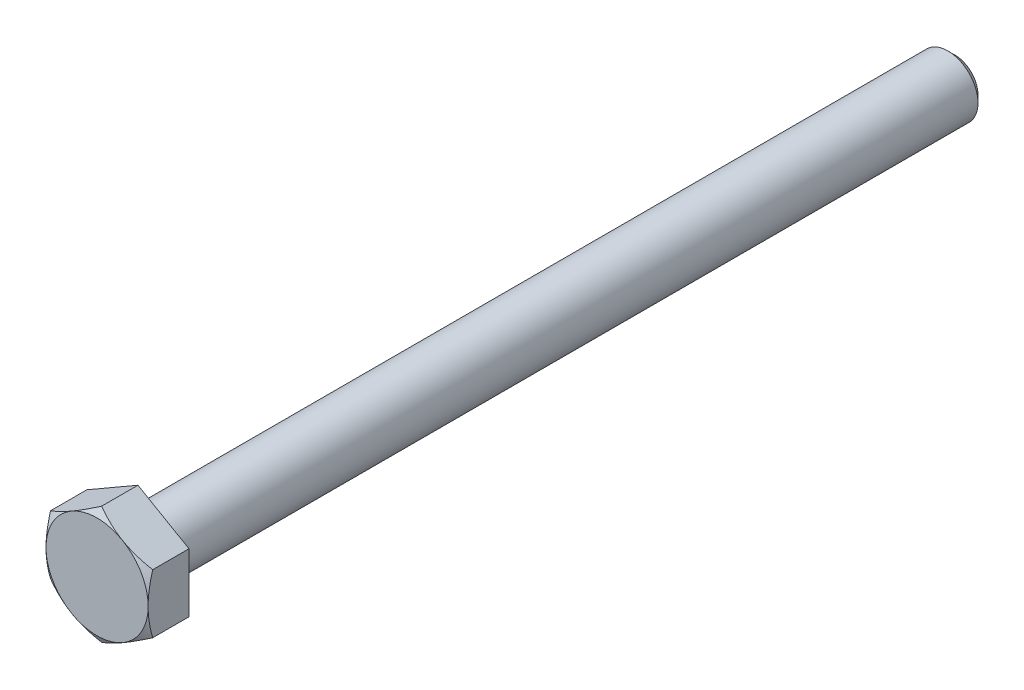
ISO-10303-21;
HEADER;
FILE_DESCRIPTION(('STEP AP214'),'2;1');
FILE_NAME('part.step','',(''),(''),'','','');
FILE_SCHEMA(('AUTOMOTIVE_DESIGN { 1 0 10303 214 1 1 1 1 }'));
ENDSEC;
DATA;
#1=APPLICATION_CONTEXT('core data for automotive mechanical design processes');
#2=APPLICATION_PROTOCOL_DEFINITION('international standard','automotive_design',2000,#1);
#3=PRODUCT_CONTEXT('',#1,'mechanical');
#4=PRODUCT('Part','Part','',(#3));
#5=PRODUCT_RELATED_PRODUCT_CATEGORY('part','',(#4));
#6=PRODUCT_DEFINITION_FORMATION('','',#4);
#7=PRODUCT_DEFINITION_CONTEXT('part definition',#1,'design');
#8=PRODUCT_DEFINITION('design','',#6,#7);
#9=PRODUCT_DEFINITION_SHAPE('','',#8);
#10=(LENGTH_UNIT() NAMED_UNIT(*) SI_UNIT(.MILLI.,.METRE.));
#11=(NAMED_UNIT(*) PLANE_ANGLE_UNIT() SI_UNIT($,.RADIAN.));
#12=(NAMED_UNIT(*) SI_UNIT($,.STERADIAN.) SOLID_ANGLE_UNIT());
#13=UNCERTAINTY_MEASURE_WITH_UNIT(LENGTH_MEASURE(1.E-05),#10,'distance_accuracy_value','');
#14=(GEOMETRIC_REPRESENTATION_CONTEXT(3) GLOBAL_UNCERTAINTY_ASSIGNED_CONTEXT((#13)) GLOBAL_UNIT_ASSIGNED_CONTEXT((#10,
#11,#12)) REPRESENTATION_CONTEXT('',''));
#15=CARTESIAN_POINT('',(0.,0.,0.));
#16=DIRECTION('',(0.,0.,1.));
#17=DIRECTION('',(1.,0.,0.));
#18=AXIS2_PLACEMENT_3D('',#15,#16,#17);
#19=CARTESIAN_POINT('',(-5.,-2.88675134594813,4.));
#20=DIRECTION('',(0.,0.,1.));
#21=DIRECTION('',(1.,0.,0.));
#22=AXIS2_PLACEMENT_3D('',#19,#20,#21);
#23=PLANE('',#22);
#24=CARTESIAN_POINT('',(0.,0.,4.));
#25=DIRECTION('',(0.,0.,1.));
#26=DIRECTION('',(1.,0.,0.));
#27=AXIS2_PLACEMENT_3D('',#24,#25,#26);
#28=CIRCLE('',#27,5.);
#29=CARTESIAN_POINT('',(2.5,-4.33012701892219,4.));
#30=VERTEX_POINT('',#29);
#31=CARTESIAN_POINT('',(5.,0.,4.));
#32=VERTEX_POINT('',#31);
#33=EDGE_CURVE('E170',#30,#32,#28,.T.);
#34=ORIENTED_EDGE('',*,*,#33,.T.);
#35=CARTESIAN_POINT('',(0.,0.,4.));
#36=DIRECTION('',(0.,0.,1.));
#37=DIRECTION('',(1.,0.,0.));
#38=AXIS2_PLACEMENT_3D('',#35,#36,#37);
#39=CIRCLE('',#38,5.);
#40=CARTESIAN_POINT('',(2.5,4.33012701892219,4.));
#41=VERTEX_POINT('',#40);
#42=EDGE_CURVE('E11',#32,#41,#39,.T.);
#43=ORIENTED_EDGE('',*,*,#42,.T.);
#44=CARTESIAN_POINT('',(0.,0.,4.));
#45=DIRECTION('',(0.,0.,1.));
#46=DIRECTION('',(1.,0.,0.));
#47=AXIS2_PLACEMENT_3D('',#44,#45,#46);
#48=CIRCLE('',#47,5.);
#49=CARTESIAN_POINT('',(-2.5,4.3301270189222,4.));
#50=VERTEX_POINT('',#49);
#51=EDGE_CURVE('E28',#41,#50,#48,.T.);
#52=ORIENTED_EDGE('',*,*,#51,.T.);
#53=CARTESIAN_POINT('',(0.,0.,4.));
#54=DIRECTION('',(0.,0.,1.));
#55=DIRECTION('',(1.,0.,0.));
#56=AXIS2_PLACEMENT_3D('',#53,#54,#55);
#57=CIRCLE('',#56,5.);
#58=CARTESIAN_POINT('',(-5.,0.,4.));
#59=VERTEX_POINT('',#58);
#60=EDGE_CURVE('E182',#50,#59,#57,.T.);
#61=ORIENTED_EDGE('',*,*,#60,.T.);
#62=CARTESIAN_POINT('',(0.,0.,4.));
#63=DIRECTION('',(0.,0.,1.));
#64=DIRECTION('',(1.,0.,0.));
#65=AXIS2_PLACEMENT_3D('',#62,#63,#64);
#66=CIRCLE('',#65,5.);
#67=CARTESIAN_POINT('',(-2.5,-4.33012701892219,4.));
#68=VERTEX_POINT('',#67);
#69=EDGE_CURVE('E179',#59,#68,#66,.T.);
#70=ORIENTED_EDGE('',*,*,#69,.T.);
#71=CARTESIAN_POINT('',(0.,0.,4.));
#72=DIRECTION('',(0.,0.,1.));
#73=DIRECTION('',(1.,0.,0.));
#74=AXIS2_PLACEMENT_3D('',#71,#72,#73);
#75=CIRCLE('',#74,5.);
#76=EDGE_CURVE('E174',#68,#30,#75,.T.);
#77=ORIENTED_EDGE('',*,*,#76,.T.);
#78=EDGE_LOOP('',(#34,#43,#52,#61,#70,#77));
#79=FACE_BOUND('',#78,.T.);
#80=ADVANCED_FACE('F17',(#79),#23,.T.);
#81=CARTESIAN_POINT('',(0.,0.,4.));
#82=DIRECTION('',(0.,0.,-1.));
#83=DIRECTION('',(1.,0.,0.));
#84=AXIS2_PLACEMENT_3D('',#81,#82,#83);
#85=CONICAL_SURFACE('',#84,5.,1.0471975511966);
#86=CARTESIAN_POINT('',(5.00000000000001,0.,3.99999999999999));
#87=CARTESIAN_POINT('',(5.00000000000001,1.3397459621589,3.99999999999999));
#88=CARTESIAN_POINT('',(5.00000000000001,2.88675134595628,3.55341801261243));
#89=(BOUNDED_CURVE() B_SPLINE_CURVE(2,(#86,#87,#88),.UNSPECIFIED.,.F.,
.F.) B_SPLINE_CURVE_WITH_KNOTS((3,3),(1.36602540378444,1.90331036969753),
.UNSPECIFIED.) CURVE() GEOMETRIC_REPRESENTATION_ITEM() RATIONAL_B_SPLINE_CURVE((1.86602540378444,
1.86602540378444,1.73205080756823)) REPRESENTATION_ITEM(''));
#90=CARTESIAN_POINT('',(5.,2.88675134594813,3.55341801261479));
#91=VERTEX_POINT('',#90);
#92=EDGE_CURVE('E230',#32,#91,#89,.T.);
#93=ORIENTED_EDGE('',*,*,#92,.T.);
#94=CARTESIAN_POINT('',(5.00000000000706,2.88675134594406,3.55341801261243));
#95=CARTESIAN_POINT('',(3.66025403784724,3.66025403784274,3.99999999999998));
#96=CARTESIAN_POINT('',(2.50000000000003,4.33012701892218,3.99999999999999));
#97=(BOUNDED_CURVE() B_SPLINE_CURVE(2,(#94,#95,#96),.UNSPECIFIED.,.F.,
.F.) B_SPLINE_CURVE_WITH_KNOTS((3,3),(0.828740437871357,1.36602540378444),
.UNSPECIFIED.) CURVE() GEOMETRIC_REPRESENTATION_ITEM() RATIONAL_B_SPLINE_CURVE((1.73205080756823,
1.86602540378444,1.86602540378444)) REPRESENTATION_ITEM(''));
#98=EDGE_CURVE('E219',#91,#41,#97,.T.);
#99=ORIENTED_EDGE('',*,*,#98,.T.);
#100=ORIENTED_EDGE('',*,*,#42,.F.);
#101=EDGE_LOOP('',(#93,#99,#100));
#102=FACE_BOUND('',#101,.T.);
#103=ADVANCED_FACE('F305',(#102),#85,.T.);
#104=CARTESIAN_POINT('',(0.,0.,4.));
#105=DIRECTION('',(0.,0.,-1.));
#106=DIRECTION('',(1.,0.,0.));
#107=AXIS2_PLACEMENT_3D('',#104,#105,#106);
#108=CONICAL_SURFACE('',#107,5.,1.0471975511966);
#109=CARTESIAN_POINT('',(2.50000000000003,4.33012701892218,3.99999999999999));
#110=CARTESIAN_POINT('',(1.3397459621528,5.00000000000162,4.));
#111=CARTESIAN_POINT('',(-7.03419750679371E-12,5.77350269190032,3.55341801261244));
#112=(BOUNDED_CURVE() B_SPLINE_CURVE(2,(#109,#110,#111),.UNSPECIFIED.,.F.,
.F.) B_SPLINE_CURVE_WITH_KNOTS((3,3),(1.36602540378444,1.90331036969752),
.UNSPECIFIED.) CURVE() GEOMETRIC_REPRESENTATION_ITEM() RATIONAL_B_SPLINE_CURVE((1.86602540378444,
1.86602540378445,1.73205080756823)) REPRESENTATION_ITEM(''));
#113=CARTESIAN_POINT('',(0.,5.77350269189626,3.55341801261479));
#114=VERTEX_POINT('',#113);
#115=EDGE_CURVE('E218',#41,#114,#112,.T.);
#116=ORIENTED_EDGE('',*,*,#115,.T.);
#117=CARTESIAN_POINT('',(7.05265794858301E-12,5.77350269190033,3.55341801261244));
#118=CARTESIAN_POINT('',(-1.33974596215277,5.00000000000165,3.99999999999999));
#119=CARTESIAN_POINT('',(-2.49999999999998,4.33012701892221,3.99999999999999));
#120=(BOUNDED_CURVE() B_SPLINE_CURVE(2,(#117,#118,#119),.UNSPECIFIED.,.F.,
.F.) B_SPLINE_CURVE_WITH_KNOTS((3,3),(0.828740437871358,1.36602540378444),
.UNSPECIFIED.) CURVE() GEOMETRIC_REPRESENTATION_ITEM() RATIONAL_B_SPLINE_CURVE((1.73205080756823,
1.86602540378444,1.86602540378444)) REPRESENTATION_ITEM(''));
#121=EDGE_CURVE('E240',#114,#50,#120,.T.);
#122=ORIENTED_EDGE('',*,*,#121,.T.);
#123=ORIENTED_EDGE('',*,*,#51,.F.);
#124=EDGE_LOOP('',(#116,#122,#123));
#125=FACE_BOUND('',#124,.T.);
#126=ADVANCED_FACE('F313',(#125),#108,.T.);
#127=CARTESIAN_POINT('',(0.,0.,4.));
#128=DIRECTION('',(0.,0.,-1.));
#129=DIRECTION('',(1.,0.,0.));
#130=AXIS2_PLACEMENT_3D('',#127,#128,#129);
#131=CONICAL_SURFACE('',#130,5.,1.0471975511966);
#132=CARTESIAN_POINT('',(-5.,2.88675134595627,3.55341801261243));
#133=CARTESIAN_POINT('',(-5.,1.33974596215889,3.99999999999999));
#134=CARTESIAN_POINT('',(-5.,0.,3.99999999999999));
#135=(BOUNDED_CURVE() B_SPLINE_CURVE(2,(#132,#133,#134),.UNSPECIFIED.,.F.,
.F.) B_SPLINE_CURVE_WITH_KNOTS((3,3),(0.828740437871356,1.36602540378444),
.UNSPECIFIED.) CURVE() GEOMETRIC_REPRESENTATION_ITEM() RATIONAL_B_SPLINE_CURVE((1.73205080756823,
1.86602540378445,1.86602540378445)) REPRESENTATION_ITEM(''));
#136=CARTESIAN_POINT('',(-5.,2.88675134594813,3.55341801261479));
#137=VERTEX_POINT('',#136);
#138=EDGE_CURVE('E131',#137,#59,#135,.T.);
#139=ORIENTED_EDGE('',*,*,#138,.T.);
#140=ORIENTED_EDGE('',*,*,#60,.F.);
#141=CARTESIAN_POINT('',(-2.49999999999998,4.33012701892221,3.99999999999999));
#142=CARTESIAN_POINT('',(-3.66025403784722,3.66025403784276,4.));
#143=CARTESIAN_POINT('',(-5.00000000000707,2.88675134594405,3.55341801261243));
#144=(BOUNDED_CURVE() B_SPLINE_CURVE(2,(#141,#142,#143),.UNSPECIFIED.,.F.,
.F.) B_SPLINE_CURVE_WITH_KNOTS((3,3),(1.36602540378444,1.90331036969753),
.UNSPECIFIED.) CURVE() GEOMETRIC_REPRESENTATION_ITEM() RATIONAL_B_SPLINE_CURVE((1.86602540378444,
1.86602540378444,1.73205080756823)) REPRESENTATION_ITEM(''));
#145=EDGE_CURVE('E175',#50,#137,#144,.T.);
#146=ORIENTED_EDGE('',*,*,#145,.T.);
#147=EDGE_LOOP('',(#139,#140,#146));
#148=FACE_BOUND('',#147,.T.);
#149=ADVANCED_FACE('F577',(#148),#131,.T.);
#150=CARTESIAN_POINT('',(0.,0.,4.));
#151=DIRECTION('',(0.,0.,-1.));
#152=DIRECTION('',(1.,0.,0.));
#153=AXIS2_PLACEMENT_3D('',#150,#151,#152);
#154=CONICAL_SURFACE('',#153,5.,1.0471975511966);
#155=CARTESIAN_POINT('',(-5.,0.,3.99999999999999));
#156=CARTESIAN_POINT('',(-5.,-1.33974596215888,3.99999999999999));
#157=CARTESIAN_POINT('',(-5.,-2.88675134595629,3.55341801261243));
#158=(BOUNDED_CURVE() B_SPLINE_CURVE(2,(#155,#156,#157),.UNSPECIFIED.,.F.,
.F.) B_SPLINE_CURVE_WITH_KNOTS((3,3),(1.36602540378444,1.90331036969753),
.UNSPECIFIED.) CURVE() GEOMETRIC_REPRESENTATION_ITEM() RATIONAL_B_SPLINE_CURVE((1.86602540378445,
1.86602540378445,1.73205080756823)) REPRESENTATION_ITEM(''));
#159=CARTESIAN_POINT('',(-5.,-2.88675134594813,3.55341801261479));
#160=VERTEX_POINT('',#159);
#161=EDGE_CURVE('E178',#59,#160,#158,.T.);
#162=ORIENTED_EDGE('',*,*,#161,.T.);
#163=CARTESIAN_POINT('',(-5.00000000000705,-2.88675134594406,3.55341801261244));
#164=CARTESIAN_POINT('',(-3.66025403784723,-3.66025403784275,3.99999999999999));
#165=CARTESIAN_POINT('',(-2.50000000000001,-4.33012701892219,3.99999999999999));
#166=(BOUNDED_CURVE() B_SPLINE_CURVE(2,(#163,#164,#165),.UNSPECIFIED.,.F.,
.F.) B_SPLINE_CURVE_WITH_KNOTS((3,3),(0.828740437871359,1.36602540378444),
.UNSPECIFIED.) CURVE() GEOMETRIC_REPRESENTATION_ITEM() RATIONAL_B_SPLINE_CURVE((1.73205080756823,
1.86602540378444,1.86602540378444)) REPRESENTATION_ITEM(''));
#167=EDGE_CURVE('E190',#160,#68,#166,.T.);
#168=ORIENTED_EDGE('',*,*,#167,.T.);
#169=ORIENTED_EDGE('',*,*,#69,.F.);
#170=EDGE_LOOP('',(#162,#168,#169));
#171=FACE_BOUND('',#170,.T.);
#172=ADVANCED_FACE('F567',(#171),#154,.T.);
#173=CARTESIAN_POINT('',(0.,0.,4.));
#174=DIRECTION('',(0.,0.,-1.));
#175=DIRECTION('',(1.,0.,0.));
#176=AXIS2_PLACEMENT_3D('',#173,#174,#175);
#177=CONICAL_SURFACE('',#176,5.,1.0471975511966);
#178=CARTESIAN_POINT('',(-2.50000000000001,-4.33012701892219,3.99999999999999));
#179=CARTESIAN_POINT('',(-1.33974596215279,-5.00000000000163,3.99999999999999));
#180=CARTESIAN_POINT('',(7.02804402619727E-12,-5.77350269190032,3.55341801261244));
#181=(BOUNDED_CURVE() B_SPLINE_CURVE(2,(#178,#179,#180),.UNSPECIFIED.,.F.,
.F.) B_SPLINE_CURVE_WITH_KNOTS((3,3),(1.36602540378444,1.90331036969752),
.UNSPECIFIED.) CURVE() GEOMETRIC_REPRESENTATION_ITEM() RATIONAL_B_SPLINE_CURVE((1.86602540378444,
1.86602540378444,1.73205080756823)) REPRESENTATION_ITEM(''));
#182=CARTESIAN_POINT('',(0.,-5.77350269189626,3.55341801261479));
#183=VERTEX_POINT('',#182);
#184=EDGE_CURVE('E212',#68,#183,#181,.T.);
#185=ORIENTED_EDGE('',*,*,#184,.T.);
#186=CARTESIAN_POINT('',(-7.04753004808599E-12,-5.77350269190033,3.55341801261244));
#187=CARTESIAN_POINT('',(1.33974596215279,-5.00000000000164,3.99999999999999));
#188=CARTESIAN_POINT('',(2.50000000000001,-4.33012701892219,3.99999999999999));
#189=(BOUNDED_CURVE() B_SPLINE_CURVE(2,(#186,#187,#188),.UNSPECIFIED.,.F.,
.F.) B_SPLINE_CURVE_WITH_KNOTS((3,3),(0.828740437871358,1.36602540378444),
.UNSPECIFIED.) CURVE() GEOMETRIC_REPRESENTATION_ITEM() RATIONAL_B_SPLINE_CURVE((1.73205080756823,
1.86602540378444,1.86602540378444)) REPRESENTATION_ITEM(''));
#190=EDGE_CURVE('E169',#183,#30,#189,.T.);
#191=ORIENTED_EDGE('',*,*,#190,.T.);
#192=ORIENTED_EDGE('',*,*,#76,.F.);
#193=EDGE_LOOP('',(#185,#191,#192));
#194=FACE_BOUND('',#193,.T.);
#195=ADVANCED_FACE('F557',(#194),#177,.T.);
#196=CARTESIAN_POINT('',(0.,0.,4.));
#197=DIRECTION('',(0.,0.,-1.));
#198=DIRECTION('',(1.,0.,0.));
#199=AXIS2_PLACEMENT_3D('',#196,#197,#198);
#200=CONICAL_SURFACE('',#199,5.,1.0471975511966);
#201=CARTESIAN_POINT('',(2.50000000000001,-4.33012701892219,3.99999999999999));
#202=CARTESIAN_POINT('',(3.66025403784718,-3.66025403784278,3.99999999999999));
#203=CARTESIAN_POINT('',(5.00000000000693,-2.88675134594413,3.55341801261248));
#204=(BOUNDED_CURVE() B_SPLINE_CURVE(2,(#201,#202,#203),.UNSPECIFIED.,.F.,
.F.) B_SPLINE_CURVE_WITH_KNOTS((3,3),(1.36602540378444,1.9033103696975),
.UNSPECIFIED.) CURVE() GEOMETRIC_REPRESENTATION_ITEM() RATIONAL_B_SPLINE_CURVE((1.86602540378444,
1.86602540378444,1.73205080756824)) REPRESENTATION_ITEM(''));
#205=CARTESIAN_POINT('',(5.,-2.88675134594836,3.55341801261495));
#206=VERTEX_POINT('',#205);
#207=EDGE_CURVE('E168',#30,#206,#204,.T.);
#208=ORIENTED_EDGE('',*,*,#207,.T.);
#209=CARTESIAN_POINT('',(5.00000000000001,-2.88675134595645,3.55341801261239));
#210=CARTESIAN_POINT('',(5.00000000000001,-1.33974596215895,3.99999999999999));
#211=CARTESIAN_POINT('',(5.00000000000001,0.,3.99999999999999));
#212=(BOUNDED_CURVE() B_SPLINE_CURVE(2,(#209,#210,#211),.UNSPECIFIED.,.F.,
.F.) B_SPLINE_CURVE_WITH_KNOTS((3,3),(0.828740437871329,1.36602540378444),
.UNSPECIFIED.) CURVE() GEOMETRIC_REPRESENTATION_ITEM() RATIONAL_B_SPLINE_CURVE((1.73205080756821,
1.86602540378444,1.86602540378444)) REPRESENTATION_ITEM(''));
#213=EDGE_CURVE('E231',#206,#32,#212,.T.);
#214=ORIENTED_EDGE('',*,*,#213,.T.);
#215=ORIENTED_EDGE('',*,*,#33,.F.);
#216=EDGE_LOOP('',(#208,#214,#215));
#217=FACE_BOUND('',#216,.T.);
#218=ADVANCED_FACE('F546',(#217),#200,.T.);
#219=CARTESIAN_POINT('',(0.,0.,-80.));
#220=DIRECTION('',(0.,0.,-1.));
#221=DIRECTION('',(-1.,0.,0.));
#222=AXIS2_PLACEMENT_3D('',#219,#220,#221);
#223=PLANE('',#222);
#224=CARTESIAN_POINT('',(0.,0.,-80.));
#225=DIRECTION('',(0.,0.,-1.));
#226=DIRECTION('',(1.,0.,0.));
#227=AXIS2_PLACEMENT_3D('',#224,#225,#226);
#228=CIRCLE('',#227,2.25);
#229=CARTESIAN_POINT('',(-2.25,0.,-80.));
#230=VERTEX_POINT('',#229);
#231=EDGE_CURVE('E183',#230,#230,#228,.T.);
#232=ORIENTED_EDGE('',*,*,#231,.T.);
#233=EDGE_LOOP('',(#232));
#234=FACE_BOUND('',#233,.T.);
#235=ADVANCED_FACE('F537',(#234),#223,.T.);
#236=CARTESIAN_POINT('',(0.,5.77350269189626,4.));
#237=DIRECTION('',(0.5,-0.866025403784439,0.));
#238=DIRECTION('',(0.,0.,-1.));
#239=AXIS2_PLACEMENT_3D('',#236,#237,#238);
#240=PLANE('',#239);
#241=ORIENTED_EDGE('',*,*,#121,.F.);
#242=DIRECTION('',(0.,0.,-1.));
#243=VECTOR('',#242,1.);
#244=CARTESIAN_POINT('',(0.,5.77350269189626,4.));
#245=LINE('',#244,#243);
#246=CARTESIAN_POINT('',(0.,5.77350269189626,0.));
#247=VERTEX_POINT('',#246);
#248=EDGE_CURVE('E141',#114,#247,#245,.T.);
#249=ORIENTED_EDGE('',*,*,#248,.T.);
#250=DIRECTION('',(-0.866025403784439,-0.5,0.));
#251=VECTOR('',#250,1.);
#252=CARTESIAN_POINT('',(0.,5.77350269189626,0.));
#253=LINE('',#252,#251);
#254=CARTESIAN_POINT('',(-5.,2.88675134594813,0.));
#255=VERTEX_POINT('',#254);
#256=EDGE_CURVE('E138',#247,#255,#253,.T.);
#257=ORIENTED_EDGE('',*,*,#256,.T.);
#258=DIRECTION('',(0.,0.,-1.));
#259=VECTOR('',#258,1.);
#260=CARTESIAN_POINT('',(-5.,2.88675134594813,4.));
#261=LINE('',#260,#259);
#262=EDGE_CURVE('E123',#137,#255,#261,.T.);
#263=ORIENTED_EDGE('',*,*,#262,.F.);
#264=ORIENTED_EDGE('',*,*,#145,.F.);
#265=EDGE_LOOP('',(#241,#249,#257,#263,#264));
#266=FACE_BOUND('',#265,.T.);
#267=ADVANCED_FACE('F139',(#266),#240,.F.);
#268=CARTESIAN_POINT('',(5.,2.88675134594813,4.));
#269=DIRECTION('',(-0.5,-0.866025403784439,0.));
#270=DIRECTION('',(-0.866025403784439,0.5,0.));
#271=AXIS2_PLACEMENT_3D('',#268,#269,#270);
#272=PLANE('',#271);
#273=ORIENTED_EDGE('',*,*,#98,.F.);
#274=DIRECTION('',(0.,0.,-1.));
#275=VECTOR('',#274,1.);
#276=CARTESIAN_POINT('',(5.,2.88675134594813,4.));
#277=LINE('',#276,#275);
#278=CARTESIAN_POINT('',(5.,2.88675134594813,0.));
#279=VERTEX_POINT('',#278);
#280=EDGE_CURVE('E227',#91,#279,#277,.T.);
#281=ORIENTED_EDGE('',*,*,#280,.T.);
#282=DIRECTION('',(-0.866025403784439,0.5,0.));
#283=VECTOR('',#282,1.);
#284=CARTESIAN_POINT('',(5.,2.88675134594813,0.));
#285=LINE('',#284,#283);
#286=EDGE_CURVE('E146',#279,#247,#285,.T.);
#287=ORIENTED_EDGE('',*,*,#286,.T.);
#288=ORIENTED_EDGE('',*,*,#248,.F.);
#289=ORIENTED_EDGE('',*,*,#115,.F.);
#290=EDGE_LOOP('',(#273,#281,#287,#288,#289));
#291=FACE_BOUND('',#290,.T.);
#292=ADVANCED_FACE('F309',(#291),#272,.F.);
#293=CARTESIAN_POINT('',(5.,-2.88675134594813,4.));
#294=DIRECTION('',(-1.,0.,0.));
#295=DIRECTION('',(0.,1.,0.));
#296=AXIS2_PLACEMENT_3D('',#293,#294,#295);
#297=PLANE('',#296);
#298=ORIENTED_EDGE('',*,*,#213,.F.);
#299=DIRECTION('',(0.,0.,-1.));
#300=VECTOR('',#299,1.);
#301=CARTESIAN_POINT('',(5.,-2.88675134594813,4.));
#302=LINE('',#301,#300);
#303=CARTESIAN_POINT('',(5.,-2.88675134594813,0.));
#304=VERTEX_POINT('',#303);
#305=EDGE_CURVE('E165',#206,#304,#302,.T.);
#306=ORIENTED_EDGE('',*,*,#305,.T.);
#307=DIRECTION('',(0.,1.,0.));
#308=VECTOR('',#307,1.);
#309=CARTESIAN_POINT('',(5.,-2.88675134594813,0.));
#310=LINE('',#309,#308);
#311=EDGE_CURVE('E241',#304,#279,#310,.T.);
#312=ORIENTED_EDGE('',*,*,#311,.T.);
#313=ORIENTED_EDGE('',*,*,#280,.F.);
#314=ORIENTED_EDGE('',*,*,#92,.F.);
#315=EDGE_LOOP('',(#298,#306,#312,#313,#314));
#316=FACE_BOUND('',#315,.T.);
#317=ADVANCED_FACE('F19',(#316),#297,.F.);
#318=CARTESIAN_POINT('',(0.,-5.77350269189626,4.));
#319=DIRECTION('',(-0.5,0.866025403784439,0.));
#320=DIRECTION('',(0.,0.,1.));
#321=AXIS2_PLACEMENT_3D('',#318,#319,#320);
#322=PLANE('',#321);
#323=ORIENTED_EDGE('',*,*,#190,.F.);
#324=DIRECTION('',(0.,0.,-1.));
#325=VECTOR('',#324,1.);
#326=CARTESIAN_POINT('',(0.,-5.77350269189626,4.));
#327=LINE('',#326,#325);
#328=CARTESIAN_POINT('',(0.,-5.77350269189626,0.));
#329=VERTEX_POINT('',#328);
#330=EDGE_CURVE('E21',#183,#329,#327,.T.);
#331=ORIENTED_EDGE('',*,*,#330,.T.);
#332=DIRECTION('',(0.866025403784439,0.5,0.));
#333=VECTOR('',#332,1.);
#334=CARTESIAN_POINT('',(0.,-5.77350269189626,0.));
#335=LINE('',#334,#333);
#336=EDGE_CURVE('E248',#329,#304,#335,.T.);
#337=ORIENTED_EDGE('',*,*,#336,.T.);
#338=ORIENTED_EDGE('',*,*,#305,.F.);
#339=ORIENTED_EDGE('',*,*,#207,.F.);
#340=EDGE_LOOP('',(#323,#331,#337,#338,#339));
#341=FACE_BOUND('',#340,.T.);
#342=ADVANCED_FACE('F347',(#341),#322,.F.);
#343=CARTESIAN_POINT('',(-5.,-2.88675134594813,4.));
#344=DIRECTION('',(0.5,0.866025403784439,0.));
#345=DIRECTION('',(0.,0.,-1.));
#346=AXIS2_PLACEMENT_3D('',#343,#344,#345);
#347=PLANE('',#346);
#348=ORIENTED_EDGE('',*,*,#167,.F.);
#349=DIRECTION('',(0.,0.,-1.));
#350=VECTOR('',#349,1.);
#351=CARTESIAN_POINT('',(-5.,-2.88675134594813,4.));
#352=LINE('',#351,#350);
#353=CARTESIAN_POINT('',(-5.,-2.88675134594813,0.));
#354=VERTEX_POINT('',#353);
#355=EDGE_CURVE('E135',#160,#354,#352,.T.);
#356=ORIENTED_EDGE('',*,*,#355,.T.);
#357=DIRECTION('',(0.866025403784439,-0.5,0.));
#358=VECTOR('',#357,1.);
#359=CARTESIAN_POINT('',(-5.,-2.88675134594813,0.));
#360=LINE('',#359,#358);
#361=EDGE_CURVE('E152',#354,#329,#360,.T.);
#362=ORIENTED_EDGE('',*,*,#361,.T.);
#363=ORIENTED_EDGE('',*,*,#330,.F.);
#364=ORIENTED_EDGE('',*,*,#184,.F.);
#365=EDGE_LOOP('',(#348,#356,#362,#363,#364));
#366=FACE_BOUND('',#365,.T.);
#367=ADVANCED_FACE('F490',(#366),#347,.F.);
#368=CARTESIAN_POINT('',(-5.,2.88675134594813,4.));
#369=DIRECTION('',(1.,0.,0.));
#370=DIRECTION('',(0.,0.,-1.));
#371=AXIS2_PLACEMENT_3D('',#368,#369,#370);
#372=PLANE('',#371);
#373=ORIENTED_EDGE('',*,*,#138,.F.);
#374=ORIENTED_EDGE('',*,*,#262,.T.);
#375=DIRECTION('',(0.,-1.,0.));
#376=VECTOR('',#375,1.);
#377=CARTESIAN_POINT('',(-5.,2.88675134594813,0.));
#378=LINE('',#377,#376);
#379=EDGE_CURVE('E128',#255,#354,#378,.T.);
#380=ORIENTED_EDGE('',*,*,#379,.T.);
#381=ORIENTED_EDGE('',*,*,#355,.F.);
#382=ORIENTED_EDGE('',*,*,#161,.F.);
#383=EDGE_LOOP('',(#373,#374,#380,#381,#382));
#384=FACE_BOUND('',#383,.T.);
#385=ADVANCED_FACE('F125',(#384),#372,.F.);
#386=CARTESIAN_POINT('',(-5.,-2.88675134594813,0.));
#387=DIRECTION('',(0.,0.,1.));
#388=DIRECTION('',(1.,0.,0.));
#389=AXIS2_PLACEMENT_3D('',#386,#387,#388);
#390=PLANE('',#389);
#391=CARTESIAN_POINT('',(0.,0.,0.));
#392=DIRECTION('',(0.,0.,-1.));
#393=DIRECTION('',(-1.,0.,0.));
#394=AXIS2_PLACEMENT_3D('',#391,#392,#393);
#395=CIRCLE('',#394,2.942);
#396=CARTESIAN_POINT('',(2.942,0.,0.));
#397=VERTEX_POINT('',#396);
#398=EDGE_CURVE('E154',#397,#397,#395,.T.);
#399=ORIENTED_EDGE('',*,*,#398,.F.);
#400=EDGE_LOOP('',(#399));
#401=FACE_BOUND('',#400,.T.);
#402=ORIENTED_EDGE('',*,*,#379,.F.);
#403=ORIENTED_EDGE('',*,*,#256,.F.);
#404=ORIENTED_EDGE('',*,*,#286,.F.);
#405=ORIENTED_EDGE('',*,*,#311,.F.);
#406=ORIENTED_EDGE('',*,*,#336,.F.);
#407=ORIENTED_EDGE('',*,*,#361,.F.);
#408=EDGE_LOOP('',(#402,#403,#404,#405,#406,#407));
#409=FACE_BOUND('',#408,.T.);
#410=ADVANCED_FACE('F149',(#401,#409),#390,.F.);
#411=CARTESIAN_POINT('',(0.,0.,0.));
#412=DIRECTION('',(0.,0.,-1.));
#413=DIRECTION('',(-1.,0.,0.));
#414=AXIS2_PLACEMENT_3D('',#411,#412,#413);
#415=CYLINDRICAL_SURFACE('',#414,2.942);
#416=CARTESIAN_POINT('',(0.,0.,-79.308));
#417=DIRECTION('',(0.,0.,1.));
#418=DIRECTION('',(-1.,0.,0.));
#419=AXIS2_PLACEMENT_3D('',#416,#417,#418);
#420=CIRCLE('',#419,2.942);
#421=CARTESIAN_POINT('',(2.942,0.,-79.308));
#422=VERTEX_POINT('',#421);
#423=CARTESIAN_POINT('',(-2.942,0.,-79.308));
#424=VERTEX_POINT('',#423);
#425=EDGE_CURVE('E222',#422,#424,#420,.T.);
#426=ORIENTED_EDGE('',*,*,#425,.T.);
#427=CARTESIAN_POINT('',(0.,0.,-79.308));
#428=DIRECTION('',(0.,0.,1.));
#429=DIRECTION('',(-1.,0.,0.));
#430=AXIS2_PLACEMENT_3D('',#427,#428,#429);
#431=CIRCLE('',#430,2.942);
#432=EDGE_CURVE('E225',#424,#422,#431,.T.);
#433=ORIENTED_EDGE('',*,*,#432,.T.);
#434=DIRECTION('',(0.,0.,1.));
#435=VECTOR('',#434,1.);
#436=CARTESIAN_POINT('',(2.942,0.,0.));
#437=LINE('',#436,#435);
#438=EDGE_CURVE('E160',#422,#397,#437,.T.);
#439=ORIENTED_EDGE('',*,*,#438,.T.);
#440=ORIENTED_EDGE('',*,*,#398,.T.);
#441=ORIENTED_EDGE('',*,*,#438,.F.);
#442=EDGE_LOOP('',(#426,#433,#439,#440,#441));
#443=FACE_BOUND('',#442,.T.);
#444=ADVANCED_FACE('F456',(#443),#415,.T.);
#445=CARTESIAN_POINT('',(0.,0.,-79.625));
#446=DIRECTION('',(0.,0.,1.));
#447=DIRECTION('',(1.,0.,0.));
#448=AXIS2_PLACEMENT_3D('',#445,#446,#447);
#449=CONICAL_SURFACE('',#448,2.625,0.785398163397448);
#450=ORIENTED_EDGE('',*,*,#231,.F.);
#451=DIRECTION('',(-0.707106781186548,0.,0.707106781186548));
#452=VECTOR('',#451,1.);
#453=CARTESIAN_POINT('',(-2.625,0.,-79.625));
#454=LINE('',#453,#452);
#455=EDGE_CURVE('E187',#230,#424,#454,.T.);
#456=ORIENTED_EDGE('',*,*,#455,.T.);
#457=ORIENTED_EDGE('',*,*,#425,.F.);
#458=ORIENTED_EDGE('',*,*,#432,.F.);
#459=ORIENTED_EDGE('',*,*,#455,.F.);
#460=EDGE_LOOP('',(#450,#456,#457,#458,#459));
#461=FACE_BOUND('',#460,.T.);
#462=ADVANCED_FACE('F450',(#461),#449,.T.);
#463=CLOSED_SHELL('',(#80,#103,#126,#149,#172,#195,#218,#235,#267,#292,#317,#342,#367,#385,#410,
#444,#462));
#464=MANIFOLD_SOLID_BREP('B1',#463);
#465=ADVANCED_BREP_SHAPE_REPRESENTATION('',(#18,#464),#14);
#466=SHAPE_DEFINITION_REPRESENTATION(#9,#465);
ENDSEC;
END-ISO-10303-21;
